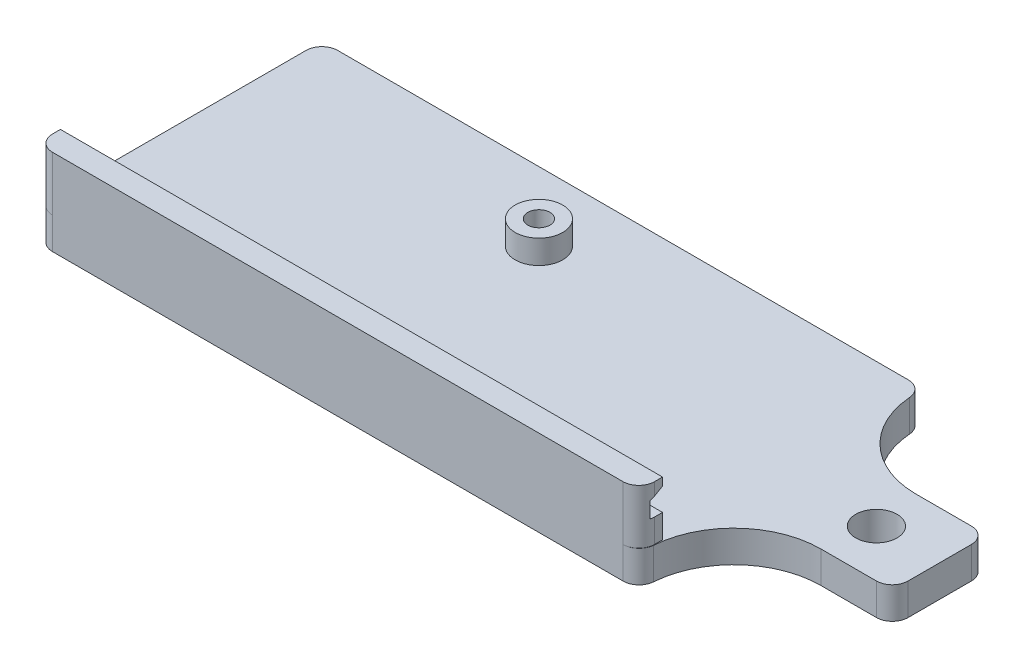
ISO-10303-21;
HEADER;
FILE_DESCRIPTION(('STEP AP214'),'2;1');
FILE_NAME('part.step','',(''),(''),'','','');
FILE_SCHEMA(('AUTOMOTIVE_DESIGN { 1 0 10303 214 1 1 1 1 }'));
ENDSEC;
DATA;
#1=APPLICATION_CONTEXT('core data for automotive mechanical design processes');
#2=APPLICATION_PROTOCOL_DEFINITION('international standard','automotive_design',2000,#1);
#3=PRODUCT_CONTEXT('',#1,'mechanical');
#4=PRODUCT('Part','Part','',(#3));
#5=PRODUCT_RELATED_PRODUCT_CATEGORY('part','',(#4));
#6=PRODUCT_DEFINITION_FORMATION('','',#4);
#7=PRODUCT_DEFINITION_CONTEXT('part definition',#1,'design');
#8=PRODUCT_DEFINITION('design','',#6,#7);
#9=PRODUCT_DEFINITION_SHAPE('','',#8);
#10=(LENGTH_UNIT() NAMED_UNIT(*) SI_UNIT(.MILLI.,.METRE.));
#11=(NAMED_UNIT(*) PLANE_ANGLE_UNIT() SI_UNIT($,.RADIAN.));
#12=(NAMED_UNIT(*) SI_UNIT($,.STERADIAN.) SOLID_ANGLE_UNIT());
#13=UNCERTAINTY_MEASURE_WITH_UNIT(LENGTH_MEASURE(1.E-05),#10,'distance_accuracy_value','');
#14=(GEOMETRIC_REPRESENTATION_CONTEXT(3) GLOBAL_UNCERTAINTY_ASSIGNED_CONTEXT((#13)) GLOBAL_UNIT_ASSIGNED_CONTEXT((#10,
#11,#12)) REPRESENTATION_CONTEXT('',''));
#15=CARTESIAN_POINT('',(0.,0.,0.));
#16=DIRECTION('',(0.,0.,1.));
#17=DIRECTION('',(1.,0.,0.));
#18=AXIS2_PLACEMENT_3D('',#15,#16,#17);
#19=CARTESIAN_POINT('',(76.,0.,0.));
#20=DIRECTION('',(-1.,0.,0.));
#21=DIRECTION('',(0.,0.,1.));
#22=AXIS2_PLACEMENT_3D('',#19,#20,#21);
#23=PLANE('',#22);
#24=DIRECTION('',(0.,0.,-1.));
#25=VECTOR('',#24,1.);
#26=CARTESIAN_POINT('',(76.,10.8660254037844,36.));
#27=LINE('',#26,#25);
#28=CARTESIAN_POINT('',(76.,10.8660254037844,34.));
#29=VERTEX_POINT('',#28);
#30=CARTESIAN_POINT('',(76.,10.8660254037844,33.));
#31=VERTEX_POINT('',#30);
#32=EDGE_CURVE('E204',#29,#31,#27,.T.);
#33=ORIENTED_EDGE('',*,*,#32,.F.);
#34=DIRECTION('',(0.,1.,0.));
#35=VECTOR('',#34,1.);
#36=CARTESIAN_POINT('',(76.,0.,34.));
#37=LINE('',#36,#35);
#38=CARTESIAN_POINT('',(76.,9.28867513459482,34.));
#39=VERTEX_POINT('',#38);
#40=EDGE_CURVE('E387',#29,#39,#37,.F.);
#41=ORIENTED_EDGE('',*,*,#40,.T.);
#42=DIRECTION('',(0.,-0.499999999999997,0.86602540378444));
#43=VECTOR('',#42,1.);
#44=CARTESIAN_POINT('',(76.,9.86602540378444,33.));
#45=LINE('',#44,#43);
#46=CARTESIAN_POINT('',(76.,9.86602540378444,33.));
#47=VERTEX_POINT('',#46);
#48=EDGE_CURVE('E228',#47,#39,#45,.T.);
#49=ORIENTED_EDGE('',*,*,#48,.F.);
#50=DIRECTION('',(0.,-1.,0.));
#51=VECTOR('',#50,1.);
#52=CARTESIAN_POINT('',(76.,10.8660254037844,33.));
#53=LINE('',#52,#51);
#54=EDGE_CURVE('E215',#31,#47,#53,.T.);
#55=ORIENTED_EDGE('',*,*,#54,.F.);
#56=EDGE_LOOP('',(#33,#41,#49,#55));
#57=FACE_BOUND('',#56,.T.);
#58=ADVANCED_FACE('F37',(#57),#23,.F.);
#59=CARTESIAN_POINT('',(0.,4.,2.00000000000001));
#60=DIRECTION('',(1.,0.,0.));
#61=DIRECTION('',(0.,0.,-1.));
#62=AXIS2_PLACEMENT_3D('',#59,#60,#61);
#63=PLANE('',#62);
#64=DIRECTION('',(0.,-1.,0.));
#65=VECTOR('',#64,1.);
#66=CARTESIAN_POINT('',(0.,4.,34.));
#67=LINE('',#66,#65);
#68=CARTESIAN_POINT('',(0.,4.,34.));
#69=VERTEX_POINT('',#68);
#70=CARTESIAN_POINT('',(0.,0.,34.));
#71=VERTEX_POINT('',#70);
#72=EDGE_CURVE('E327',#69,#71,#67,.T.);
#73=ORIENTED_EDGE('',*,*,#72,.F.);
#74=DIRECTION('',(0.,1.,0.));
#75=VECTOR('',#74,1.);
#76=CARTESIAN_POINT('',(0.,4.,34.));
#77=LINE('',#76,#75);
#78=CARTESIAN_POINT('',(0.,7.00000000000001,34.));
#79=VERTEX_POINT('',#78);
#80=EDGE_CURVE('E362',#69,#79,#77,.T.);
#81=ORIENTED_EDGE('',*,*,#80,.T.);
#82=DIRECTION('',(0.,0.,-1.));
#83=VECTOR('',#82,1.);
#84=CARTESIAN_POINT('',(0.,7.00000000000001,34.5));
#85=LINE('',#84,#83);
#86=CARTESIAN_POINT('',(0.,7.00000000000001,33.));
#87=VERTEX_POINT('',#86);
#88=EDGE_CURVE('E245',#79,#87,#85,.T.);
#89=ORIENTED_EDGE('',*,*,#88,.T.);
#90=DIRECTION('',(0.,-1.,0.));
#91=VECTOR('',#90,1.);
#92=CARTESIAN_POINT('',(0.,7.00000000000001,33.));
#93=LINE('',#92,#91);
#94=CARTESIAN_POINT('',(0.,4.,33.));
#95=VERTEX_POINT('',#94);
#96=EDGE_CURVE('E247',#87,#95,#93,.T.);
#97=ORIENTED_EDGE('',*,*,#96,.T.);
#98=DIRECTION('',(0.,0.,1.));
#99=VECTOR('',#98,1.);
#100=CARTESIAN_POINT('',(0.,4.,2.00000000000001));
#101=LINE('',#100,#99);
#102=CARTESIAN_POINT('',(0.,4.,2.00000000000001));
#103=VERTEX_POINT('',#102);
#104=EDGE_CURVE('E286',#103,#95,#101,.T.);
#105=ORIENTED_EDGE('',*,*,#104,.F.);
#106=DIRECTION('',(0.,-1.,0.));
#107=VECTOR('',#106,1.);
#108=CARTESIAN_POINT('',(0.,4.,2.00000000000001));
#109=LINE('',#108,#107);
#110=CARTESIAN_POINT('',(0.,0.,2.00000000000001));
#111=VERTEX_POINT('',#110);
#112=EDGE_CURVE('E330',#103,#111,#109,.T.);
#113=ORIENTED_EDGE('',*,*,#112,.T.);
#114=DIRECTION('',(0.,0.,1.));
#115=VECTOR('',#114,1.);
#116=CARTESIAN_POINT('',(0.,0.,2.00000000000001));
#117=LINE('',#116,#115);
#118=EDGE_CURVE('E314',#111,#71,#117,.T.);
#119=ORIENTED_EDGE('',*,*,#118,.T.);
#120=EDGE_LOOP('',(#73,#81,#89,#97,#105,#113,#119));
#121=FACE_BOUND('',#120,.T.);
#122=ADVANCED_FACE('F454',(#121),#63,.F.);
#123=CARTESIAN_POINT('',(87.,4.,35.));
#124=DIRECTION('',(0.,-1.,0.));
#125=DIRECTION('',(0.,0.,-1.));
#126=AXIS2_PLACEMENT_3D('',#123,#124,#125);
#127=CYLINDRICAL_SURFACE('',#126,11.);
#128=CARTESIAN_POINT('',(87.,0.,35.));
#129=DIRECTION('',(0.,-1.,0.));
#130=DIRECTION('',(0.,0.,1.));
#131=AXIS2_PLACEMENT_3D('',#128,#129,#130);
#132=CIRCLE('',#131,11.);
#133=CARTESIAN_POINT('',(76.0325926642329,0.,34.1538461538462));
#134=VERTEX_POINT('',#133);
#135=CARTESIAN_POINT('',(87.,0.,24.));
#136=VERTEX_POINT('',#135);
#137=EDGE_CURVE('E252',#134,#136,#132,.T.);
#138=ORIENTED_EDGE('',*,*,#137,.T.);
#139=DIRECTION('',(0.,-1.,0.));
#140=VECTOR('',#139,1.);
#141=CARTESIAN_POINT('',(87.,4.,24.));
#142=LINE('',#141,#140);
#143=CARTESIAN_POINT('',(87.,4.,24.));
#144=VERTEX_POINT('',#143);
#145=EDGE_CURVE('E357',#144,#136,#142,.T.);
#146=ORIENTED_EDGE('',*,*,#145,.F.);
#147=CARTESIAN_POINT('',(87.,4.,35.));
#148=DIRECTION('',(0.,-1.,0.));
#149=DIRECTION('',(0.,0.,1.));
#150=AXIS2_PLACEMENT_3D('',#147,#148,#149);
#151=CIRCLE('',#150,11.);
#152=CARTESIAN_POINT('',(76.0325926642329,4.,34.1538461538462));
#153=VERTEX_POINT('',#152);
#154=EDGE_CURVE('E265',#153,#144,#151,.T.);
#155=ORIENTED_EDGE('',*,*,#154,.F.);
#156=DIRECTION('',(0.,-1.,0.));
#157=VECTOR('',#156,1.);
#158=CARTESIAN_POINT('',(76.0325926642329,4.,34.1538461538462));
#159=LINE('',#158,#157);
#160=EDGE_CURVE('E293',#153,#134,#159,.T.);
#161=ORIENTED_EDGE('',*,*,#160,.T.);
#162=EDGE_LOOP('',(#138,#146,#155,#161));
#163=FACE_BOUND('',#162,.T.);
#164=ADVANCED_FACE('F405',(#163),#127,.F.);
#165=CARTESIAN_POINT('',(87.,4.,24.));
#166=DIRECTION('',(0.,0.,-1.));
#167=DIRECTION('',(-1.,0.,0.));
#168=AXIS2_PLACEMENT_3D('',#165,#166,#167);
#169=PLANE('',#168);
#170=DIRECTION('',(1.,0.,0.));
#171=VECTOR('',#170,1.);
#172=CARTESIAN_POINT('',(87.,0.,24.));
#173=LINE('',#172,#171);
#174=CARTESIAN_POINT('',(94.,0.,24.));
#175=VERTEX_POINT('',#174);
#176=EDGE_CURVE('E296',#136,#175,#173,.T.);
#177=ORIENTED_EDGE('',*,*,#176,.T.);
#178=DIRECTION('',(0.,-1.,0.));
#179=VECTOR('',#178,1.);
#180=CARTESIAN_POINT('',(94.,4.,24.));
#181=LINE('',#180,#179);
#182=CARTESIAN_POINT('',(94.,4.,24.));
#183=VERTEX_POINT('',#182);
#184=EDGE_CURVE('E354',#183,#175,#181,.T.);
#185=ORIENTED_EDGE('',*,*,#184,.F.);
#186=DIRECTION('',(1.,0.,0.));
#187=VECTOR('',#186,1.);
#188=CARTESIAN_POINT('',(87.,4.,24.));
#189=LINE('',#188,#187);
#190=EDGE_CURVE('E268',#144,#183,#189,.T.);
#191=ORIENTED_EDGE('',*,*,#190,.F.);
#192=ORIENTED_EDGE('',*,*,#145,.T.);
#193=EDGE_LOOP('',(#177,#185,#191,#192));
#194=FACE_BOUND('',#193,.T.);
#195=ADVANCED_FACE('F412',(#194),#169,.F.);
#196=CARTESIAN_POINT('',(94.,4.,22.));
#197=DIRECTION('',(0.,-1.,0.));
#198=DIRECTION('',(0.,0.,-1.));
#199=AXIS2_PLACEMENT_3D('',#196,#197,#198);
#200=CYLINDRICAL_SURFACE('',#199,2.);
#201=CARTESIAN_POINT('',(94.,0.,22.));
#202=DIRECTION('',(0.,1.,0.));
#203=DIRECTION('',(0.,0.,-1.));
#204=AXIS2_PLACEMENT_3D('',#201,#202,#203);
#205=CIRCLE('',#204,2.);
#206=CARTESIAN_POINT('',(96.,0.,22.));
#207=VERTEX_POINT('',#206);
#208=EDGE_CURVE('E298',#175,#207,#205,.T.);
#209=ORIENTED_EDGE('',*,*,#208,.T.);
#210=DIRECTION('',(0.,-1.,0.));
#211=VECTOR('',#210,1.);
#212=CARTESIAN_POINT('',(96.,4.,22.));
#213=LINE('',#212,#211);
#214=CARTESIAN_POINT('',(96.,4.,22.));
#215=VERTEX_POINT('',#214);
#216=EDGE_CURVE('E351',#215,#207,#213,.T.);
#217=ORIENTED_EDGE('',*,*,#216,.F.);
#218=CARTESIAN_POINT('',(94.,4.,22.));
#219=DIRECTION('',(0.,1.,0.));
#220=DIRECTION('',(0.,0.,-1.));
#221=AXIS2_PLACEMENT_3D('',#218,#219,#220);
#222=CIRCLE('',#221,2.);
#223=EDGE_CURVE('E270',#183,#215,#222,.T.);
#224=ORIENTED_EDGE('',*,*,#223,.F.);
#225=ORIENTED_EDGE('',*,*,#184,.T.);
#226=EDGE_LOOP('',(#209,#217,#224,#225));
#227=FACE_BOUND('',#226,.T.);
#228=ADVANCED_FACE('F418',(#227),#200,.T.);
#229=CARTESIAN_POINT('',(96.,4.,14.));
#230=DIRECTION('',(-1.,0.,0.));
#231=DIRECTION('',(0.,0.,1.));
#232=AXIS2_PLACEMENT_3D('',#229,#230,#231);
#233=PLANE('',#232);
#234=DIRECTION('',(0.,0.,-1.));
#235=VECTOR('',#234,1.);
#236=CARTESIAN_POINT('',(96.,0.,14.));
#237=LINE('',#236,#235);
#238=CARTESIAN_POINT('',(96.,0.,14.));
#239=VERTEX_POINT('',#238);
#240=EDGE_CURVE('E300',#207,#239,#237,.T.);
#241=ORIENTED_EDGE('',*,*,#240,.T.);
#242=DIRECTION('',(0.,-1.,0.));
#243=VECTOR('',#242,1.);
#244=CARTESIAN_POINT('',(96.,4.,14.));
#245=LINE('',#244,#243);
#246=CARTESIAN_POINT('',(96.,4.,14.));
#247=VERTEX_POINT('',#246);
#248=EDGE_CURVE('E348',#247,#239,#245,.T.);
#249=ORIENTED_EDGE('',*,*,#248,.F.);
#250=DIRECTION('',(0.,0.,-1.));
#251=VECTOR('',#250,1.);
#252=CARTESIAN_POINT('',(96.,4.,14.));
#253=LINE('',#252,#251);
#254=EDGE_CURVE('E272',#215,#247,#253,.T.);
#255=ORIENTED_EDGE('',*,*,#254,.F.);
#256=ORIENTED_EDGE('',*,*,#216,.T.);
#257=EDGE_LOOP('',(#241,#249,#255,#256));
#258=FACE_BOUND('',#257,.T.);
#259=ADVANCED_FACE('F420',(#258),#233,.F.);
#260=CARTESIAN_POINT('',(94.,4.,14.));
#261=DIRECTION('',(0.,-1.,0.));
#262=DIRECTION('',(0.,0.,-1.));
#263=AXIS2_PLACEMENT_3D('',#260,#261,#262);
#264=CYLINDRICAL_SURFACE('',#263,2.);
#265=CARTESIAN_POINT('',(94.,0.,14.));
#266=DIRECTION('',(0.,1.,0.));
#267=DIRECTION('',(0.,0.,1.));
#268=AXIS2_PLACEMENT_3D('',#265,#266,#267);
#269=CIRCLE('',#268,2.);
#270=CARTESIAN_POINT('',(94.,0.,12.));
#271=VERTEX_POINT('',#270);
#272=EDGE_CURVE('E302',#239,#271,#269,.T.);
#273=ORIENTED_EDGE('',*,*,#272,.T.);
#274=DIRECTION('',(0.,-1.,0.));
#275=VECTOR('',#274,1.);
#276=CARTESIAN_POINT('',(94.,4.,12.));
#277=LINE('',#276,#275);
#278=CARTESIAN_POINT('',(94.,4.,12.));
#279=VERTEX_POINT('',#278);
#280=EDGE_CURVE('E345',#279,#271,#277,.T.);
#281=ORIENTED_EDGE('',*,*,#280,.F.);
#282=CARTESIAN_POINT('',(94.,4.,14.));
#283=DIRECTION('',(0.,1.,0.));
#284=DIRECTION('',(0.,0.,1.));
#285=AXIS2_PLACEMENT_3D('',#282,#283,#284);
#286=CIRCLE('',#285,2.);
#287=EDGE_CURVE('E274',#247,#279,#286,.T.);
#288=ORIENTED_EDGE('',*,*,#287,.F.);
#289=ORIENTED_EDGE('',*,*,#248,.T.);
#290=EDGE_LOOP('',(#273,#281,#288,#289));
#291=FACE_BOUND('',#290,.T.);
#292=ADVANCED_FACE('F425',(#291),#264,.T.);
#293=CARTESIAN_POINT('',(87.,4.,12.));
#294=DIRECTION('',(0.,0.,1.));
#295=DIRECTION('',(1.,0.,0.));
#296=AXIS2_PLACEMENT_3D('',#293,#294,#295);
#297=PLANE('',#296);
#298=DIRECTION('',(-1.,0.,0.));
#299=VECTOR('',#298,1.);
#300=CARTESIAN_POINT('',(87.,0.,12.));
#301=LINE('',#300,#299);
#302=CARTESIAN_POINT('',(87.,0.,12.));
#303=VERTEX_POINT('',#302);
#304=EDGE_CURVE('E304',#271,#303,#301,.T.);
#305=ORIENTED_EDGE('',*,*,#304,.T.);
#306=DIRECTION('',(0.,-1.,0.));
#307=VECTOR('',#306,1.);
#308=CARTESIAN_POINT('',(87.,4.,12.));
#309=LINE('',#308,#307);
#310=CARTESIAN_POINT('',(87.,4.,12.));
#311=VERTEX_POINT('',#310);
#312=EDGE_CURVE('E342',#311,#303,#309,.T.);
#313=ORIENTED_EDGE('',*,*,#312,.F.);
#314=DIRECTION('',(-1.,0.,0.));
#315=VECTOR('',#314,1.);
#316=CARTESIAN_POINT('',(87.,4.,12.));
#317=LINE('',#316,#315);
#318=EDGE_CURVE('E276',#279,#311,#317,.T.);
#319=ORIENTED_EDGE('',*,*,#318,.F.);
#320=ORIENTED_EDGE('',*,*,#280,.T.);
#321=EDGE_LOOP('',(#305,#313,#319,#320));
#322=FACE_BOUND('',#321,.T.);
#323=ADVANCED_FACE('F431',(#322),#297,.F.);
#324=CARTESIAN_POINT('',(87.,4.,0.999999999999999));
#325=DIRECTION('',(0.,-1.,0.));
#326=DIRECTION('',(0.,0.,-1.));
#327=AXIS2_PLACEMENT_3D('',#324,#325,#326);
#328=CYLINDRICAL_SURFACE('',#327,11.);
#329=CARTESIAN_POINT('',(87.,0.,0.999999999999999));
#330=DIRECTION('',(0.,-1.,0.));
#331=DIRECTION('',(0.,0.,1.));
#332=AXIS2_PLACEMENT_3D('',#329,#330,#331);
#333=CIRCLE('',#332,11.);
#334=CARTESIAN_POINT('',(76.0325926642329,0.,1.84615384615385));
#335=VERTEX_POINT('',#334);
#336=EDGE_CURVE('E306',#303,#335,#333,.T.);
#337=ORIENTED_EDGE('',*,*,#336,.T.);
#338=DIRECTION('',(0.,-1.,0.));
#339=VECTOR('',#338,1.);
#340=CARTESIAN_POINT('',(76.0325926642329,4.,1.84615384615385));
#341=LINE('',#340,#339);
#342=CARTESIAN_POINT('',(76.0325926642329,4.,1.84615384615385));
#343=VERTEX_POINT('',#342);
#344=EDGE_CURVE('E339',#343,#335,#341,.T.);
#345=ORIENTED_EDGE('',*,*,#344,.F.);
#346=CARTESIAN_POINT('',(87.,4.,0.999999999999999));
#347=DIRECTION('',(0.,-1.,0.));
#348=DIRECTION('',(0.,0.,1.));
#349=AXIS2_PLACEMENT_3D('',#346,#347,#348);
#350=CIRCLE('',#349,11.);
#351=EDGE_CURVE('E278',#311,#343,#350,.T.);
#352=ORIENTED_EDGE('',*,*,#351,.F.);
#353=ORIENTED_EDGE('',*,*,#312,.T.);
#354=EDGE_LOOP('',(#337,#345,#352,#353));
#355=FACE_BOUND('',#354,.T.);
#356=ADVANCED_FACE('F435',(#355),#328,.F.);
#357=CARTESIAN_POINT('',(74.0385186031843,4.,2.));
#358=DIRECTION('',(0.,-1.,0.));
#359=DIRECTION('',(0.,0.,-1.));
#360=AXIS2_PLACEMENT_3D('',#357,#358,#359);
#361=CYLINDRICAL_SURFACE('',#360,2.);
#362=CARTESIAN_POINT('',(74.0385186031843,0.,2.));
#363=DIRECTION('',(0.,1.,0.));
#364=DIRECTION('',(0.,0.,1.));
#365=AXIS2_PLACEMENT_3D('',#362,#363,#364);
#366=CIRCLE('',#365,2.);
#367=CARTESIAN_POINT('',(74.0385186031843,0.,0.));
#368=VERTEX_POINT('',#367);
#369=EDGE_CURVE('E308',#335,#368,#366,.T.);
#370=ORIENTED_EDGE('',*,*,#369,.T.);
#371=DIRECTION('',(0.,-1.,0.));
#372=VECTOR('',#371,1.);
#373=CARTESIAN_POINT('',(74.0385186031843,4.,0.));
#374=LINE('',#373,#372);
#375=CARTESIAN_POINT('',(74.0385186031843,4.,0.));
#376=VERTEX_POINT('',#375);
#377=EDGE_CURVE('E336',#376,#368,#374,.T.);
#378=ORIENTED_EDGE('',*,*,#377,.F.);
#379=CARTESIAN_POINT('',(74.0385186031843,4.,2.));
#380=DIRECTION('',(0.,1.,0.));
#381=DIRECTION('',(0.,0.,1.));
#382=AXIS2_PLACEMENT_3D('',#379,#380,#381);
#383=CIRCLE('',#382,2.);
#384=EDGE_CURVE('E280',#343,#376,#383,.T.);
#385=ORIENTED_EDGE('',*,*,#384,.F.);
#386=ORIENTED_EDGE('',*,*,#344,.T.);
#387=EDGE_LOOP('',(#370,#378,#385,#386));
#388=FACE_BOUND('',#387,.T.);
#389=ADVANCED_FACE('F440',(#388),#361,.T.);
#390=CARTESIAN_POINT('',(2.00000000000001,4.,0.));
#391=DIRECTION('',(0.,0.,1.));
#392=DIRECTION('',(1.,0.,0.));
#393=AXIS2_PLACEMENT_3D('',#390,#391,#392);
#394=PLANE('',#393);
#395=DIRECTION('',(-1.,0.,0.));
#396=VECTOR('',#395,1.);
#397=CARTESIAN_POINT('',(2.00000000000001,0.,0.));
#398=LINE('',#397,#396);
#399=CARTESIAN_POINT('',(2.00000000000001,0.,0.));
#400=VERTEX_POINT('',#399);
#401=EDGE_CURVE('E310',#368,#400,#398,.T.);
#402=ORIENTED_EDGE('',*,*,#401,.T.);
#403=DIRECTION('',(0.,-1.,0.));
#404=VECTOR('',#403,1.);
#405=CARTESIAN_POINT('',(2.00000000000001,4.,0.));
#406=LINE('',#405,#404);
#407=CARTESIAN_POINT('',(2.00000000000001,4.,0.));
#408=VERTEX_POINT('',#407);
#409=EDGE_CURVE('E333',#408,#400,#406,.T.);
#410=ORIENTED_EDGE('',*,*,#409,.F.);
#411=DIRECTION('',(-1.,0.,0.));
#412=VECTOR('',#411,1.);
#413=CARTESIAN_POINT('',(2.00000000000001,4.,0.));
#414=LINE('',#413,#412);
#415=EDGE_CURVE('E282',#376,#408,#414,.T.);
#416=ORIENTED_EDGE('',*,*,#415,.F.);
#417=ORIENTED_EDGE('',*,*,#377,.T.);
#418=EDGE_LOOP('',(#402,#410,#416,#417));
#419=FACE_BOUND('',#418,.T.);
#420=ADVANCED_FACE('F446',(#419),#394,.F.);
#421=CARTESIAN_POINT('',(2.,4.,2.));
#422=DIRECTION('',(0.,-1.,0.));
#423=DIRECTION('',(0.,0.,-1.));
#424=AXIS2_PLACEMENT_3D('',#421,#422,#423);
#425=CYLINDRICAL_SURFACE('',#424,2.);
#426=CARTESIAN_POINT('',(2.,0.,2.));
#427=DIRECTION('',(0.,1.,0.));
#428=DIRECTION('',(0.,0.,-1.));
#429=AXIS2_PLACEMENT_3D('',#426,#427,#428);
#430=CIRCLE('',#429,2.);
#431=EDGE_CURVE('E312',#400,#111,#430,.T.);
#432=ORIENTED_EDGE('',*,*,#431,.T.);
#433=ORIENTED_EDGE('',*,*,#112,.F.);
#434=CARTESIAN_POINT('',(2.,4.,2.));
#435=DIRECTION('',(0.,1.,0.));
#436=DIRECTION('',(0.,0.,-1.));
#437=AXIS2_PLACEMENT_3D('',#434,#435,#436);
#438=CIRCLE('',#437,2.);
#439=EDGE_CURVE('E284',#408,#103,#438,.T.);
#440=ORIENTED_EDGE('',*,*,#439,.F.);
#441=ORIENTED_EDGE('',*,*,#409,.T.);
#442=EDGE_LOOP('',(#432,#433,#440,#441));
#443=FACE_BOUND('',#442,.T.);
#444=ADVANCED_FACE('F450',(#443),#425,.T.);
#445=DIRECTION('',(0.,-0.499999999999997,0.86602540378444));
#446=VECTOR('',#445,1.);
#447=CARTESIAN_POINT('',(0.,9.86602540378444,33.));
#448=LINE('',#447,#446);
#449=CARTESIAN_POINT('',(0.,9.86602540378444,33.));
#450=VERTEX_POINT('',#449);
#451=CARTESIAN_POINT('',(0.,9.28867513459482,34.));
#452=VERTEX_POINT('',#451);
#453=EDGE_CURVE('E242',#450,#452,#448,.T.);
#454=ORIENTED_EDGE('',*,*,#453,.T.);
#455=DIRECTION('',(0.,1.,0.));
#456=VECTOR('',#455,1.);
#457=CARTESIAN_POINT('',(0.,4.,34.));
#458=LINE('',#457,#456);
#459=CARTESIAN_POINT('',(0.,10.8660254037844,34.));
#460=VERTEX_POINT('',#459);
#461=EDGE_CURVE('E360',#452,#460,#458,.T.);
#462=ORIENTED_EDGE('',*,*,#461,.T.);
#463=DIRECTION('',(0.,0.,-1.));
#464=VECTOR('',#463,1.);
#465=CARTESIAN_POINT('',(0.,10.8660254037844,36.));
#466=LINE('',#465,#464);
#467=CARTESIAN_POINT('',(0.,10.8660254037844,33.));
#468=VERTEX_POINT('',#467);
#469=EDGE_CURVE('E238',#460,#468,#466,.T.);
#470=ORIENTED_EDGE('',*,*,#469,.T.);
#471=DIRECTION('',(0.,-1.,0.));
#472=VECTOR('',#471,1.);
#473=CARTESIAN_POINT('',(0.,10.8660254037844,33.));
#474=LINE('',#473,#472);
#475=EDGE_CURVE('E222',#468,#450,#474,.T.);
#476=ORIENTED_EDGE('',*,*,#475,.T.);
#477=EDGE_LOOP('',(#454,#462,#470,#476));
#478=FACE_BOUND('',#477,.T.);
#479=ADVANCED_FACE('F506',(#478),#63,.F.);
#480=CARTESIAN_POINT('',(2.,4.,34.));
#481=DIRECTION('',(0.,-1.,0.));
#482=DIRECTION('',(0.,0.,-1.));
#483=AXIS2_PLACEMENT_3D('',#480,#481,#482);
#484=CYLINDRICAL_SURFACE('',#483,2.);
#485=CARTESIAN_POINT('',(2.,0.,34.));
#486=DIRECTION('',(0.,1.,0.));
#487=DIRECTION('',(0.,0.,1.));
#488=AXIS2_PLACEMENT_3D('',#485,#486,#487);
#489=CIRCLE('',#488,2.);
#490=CARTESIAN_POINT('',(2.,0.,36.));
#491=VERTEX_POINT('',#490);
#492=EDGE_CURVE('E316',#71,#491,#489,.T.);
#493=ORIENTED_EDGE('',*,*,#492,.T.);
#494=DIRECTION('',(0.,-1.,0.));
#495=VECTOR('',#494,1.);
#496=CARTESIAN_POINT('',(2.,4.,36.));
#497=LINE('',#496,#495);
#498=CARTESIAN_POINT('',(2.,4.,36.));
#499=VERTEX_POINT('',#498);
#500=EDGE_CURVE('E324',#499,#491,#497,.T.);
#501=ORIENTED_EDGE('',*,*,#500,.F.);
#502=CARTESIAN_POINT('',(2.,4.,34.));
#503=DIRECTION('',(0.,1.,0.));
#504=DIRECTION('',(0.,0.,1.));
#505=AXIS2_PLACEMENT_3D('',#502,#503,#504);
#506=CIRCLE('',#505,2.);
#507=EDGE_CURVE('E289',#69,#499,#506,.T.);
#508=ORIENTED_EDGE('',*,*,#507,.F.);
#509=ORIENTED_EDGE('',*,*,#72,.T.);
#510=EDGE_LOOP('',(#493,#501,#508,#509));
#511=FACE_BOUND('',#510,.T.);
#512=ADVANCED_FACE('F532',(#511),#484,.T.);
#513=CARTESIAN_POINT('',(2.00000000000002,4.,36.));
#514=DIRECTION('',(0.,0.,-1.));
#515=DIRECTION('',(-1.,0.,0.));
#516=AXIS2_PLACEMENT_3D('',#513,#514,#515);
#517=PLANE('',#516);
#518=DIRECTION('',(-1.,0.,0.));
#519=VECTOR('',#518,1.);
#520=CARTESIAN_POINT('',(76.,10.8660254037844,36.));
#521=LINE('',#520,#519);
#522=CARTESIAN_POINT('',(74.,10.8660254037844,36.));
#523=VERTEX_POINT('',#522);
#524=CARTESIAN_POINT('',(2.,10.8660254037844,36.));
#525=VERTEX_POINT('',#524);
#526=EDGE_CURVE('E224',#523,#525,#521,.T.);
#527=ORIENTED_EDGE('',*,*,#526,.T.);
#528=DIRECTION('',(0.,1.,0.));
#529=VECTOR('',#528,1.);
#530=CARTESIAN_POINT('',(2.00000000000002,4.,36.));
#531=LINE('',#530,#529);
#532=EDGE_CURVE('E383',#525,#499,#531,.F.);
#533=ORIENTED_EDGE('',*,*,#532,.T.);
#534=ORIENTED_EDGE('',*,*,#500,.T.);
#535=DIRECTION('',(1.,0.,0.));
#536=VECTOR('',#535,1.);
#537=CARTESIAN_POINT('',(2.00000000000002,0.,36.));
#538=LINE('',#537,#536);
#539=CARTESIAN_POINT('',(74.,0.,36.));
#540=VERTEX_POINT('',#539);
#541=EDGE_CURVE('E318',#491,#540,#538,.T.);
#542=ORIENTED_EDGE('',*,*,#541,.T.);
#543=DIRECTION('',(0.,1.,0.));
#544=VECTOR('',#543,1.);
#545=CARTESIAN_POINT('',(74.,4.,36.));
#546=LINE('',#545,#544);
#547=EDGE_CURVE('E380',#540,#523,#546,.T.);
#548=ORIENTED_EDGE('',*,*,#547,.T.);
#549=EDGE_LOOP('',(#527,#533,#534,#542,#548));
#550=FACE_BOUND('',#549,.T.);
#551=ADVANCED_FACE('F529',(#550),#517,.F.);
#552=CARTESIAN_POINT('',(74.0385186031843,4.,34.));
#553=DIRECTION('',(0.,-1.,0.));
#554=DIRECTION('',(0.,0.,-1.));
#555=AXIS2_PLACEMENT_3D('',#552,#553,#554);
#556=CYLINDRICAL_SURFACE('',#555,2.);
#557=CARTESIAN_POINT('',(74.0385186031843,0.,34.));
#558=DIRECTION('',(0.,1.,0.));
#559=DIRECTION('',(0.,0.,-1.));
#560=AXIS2_PLACEMENT_3D('',#557,#558,#559);
#561=CIRCLE('',#560,2.);
#562=CARTESIAN_POINT('',(74.0192593015922,0.,35.9999072676757));
#563=VERTEX_POINT('',#562);
#564=EDGE_CURVE('E60',#563,#134,#561,.T.);
#565=ORIENTED_EDGE('',*,*,#564,.T.);
#566=ORIENTED_EDGE('',*,*,#160,.F.);
#567=CARTESIAN_POINT('',(74.0385186031843,4.,34.));
#568=DIRECTION('',(0.,1.,0.));
#569=DIRECTION('',(0.,0.,-1.));
#570=AXIS2_PLACEMENT_3D('',#567,#568,#569);
#571=CIRCLE('',#570,2.);
#572=CARTESIAN_POINT('',(74.0192593015922,4.,35.9999072676757));
#573=VERTEX_POINT('',#572);
#574=EDGE_CURVE('E52',#573,#153,#571,.T.);
#575=ORIENTED_EDGE('',*,*,#574,.F.);
#576=DIRECTION('',(0.,1.,0.));
#577=VECTOR('',#576,1.);
#578=CARTESIAN_POINT('',(74.0192593015922,4.,35.9999072676757));
#579=LINE('',#578,#577);
#580=EDGE_CURVE('E11',#573,#563,#579,.F.);
#581=ORIENTED_EDGE('',*,*,#580,.T.);
#582=EDGE_LOOP('',(#565,#566,#575,#581));
#583=FACE_BOUND('',#582,.T.);
#584=ADVANCED_FACE('F402',(#583),#556,.T.);
#585=CARTESIAN_POINT('',(87.,4.,35.));
#586=DIRECTION('',(0.,1.,0.));
#587=DIRECTION('',(0.,0.,1.));
#588=AXIS2_PLACEMENT_3D('',#585,#586,#587);
#589=PLANE('',#588);
#590=CARTESIAN_POINT('',(88.,4.,18.));
#591=DIRECTION('',(0.,1.,0.));
#592=DIRECTION('',(0.,0.,1.));
#593=AXIS2_PLACEMENT_3D('',#590,#591,#592);
#594=CIRCLE('',#593,2.6);
#595=CARTESIAN_POINT('',(88.,4.,20.6));
#596=VERTEX_POINT('',#595);
#597=EDGE_CURVE('E469',#596,#596,#594,.T.);
#598=ORIENTED_EDGE('',*,*,#597,.F.);
#599=EDGE_LOOP('',(#598));
#600=FACE_BOUND('',#599,.T.);
#601=CARTESIAN_POINT('',(36.1,4.,8.7));
#602=DIRECTION('',(0.,1.,0.));
#603=DIRECTION('',(0.,0.,1.));
#604=AXIS2_PLACEMENT_3D('',#601,#602,#603);
#605=CIRCLE('',#604,3.);
#606=CARTESIAN_POINT('',(36.1,4.,11.7));
#607=VERTEX_POINT('',#606);
#608=EDGE_CURVE('E466',#607,#607,#605,.T.);
#609=ORIENTED_EDGE('',*,*,#608,.F.);
#610=EDGE_LOOP('',(#609));
#611=FACE_BOUND('',#610,.T.);
#612=DIRECTION('',(-1.,0.,0.));
#613=VECTOR('',#612,1.);
#614=CARTESIAN_POINT('',(76.,4.,33.));
#615=LINE('',#614,#613);
#616=CARTESIAN_POINT('',(76.,4.,33.));
#617=VERTEX_POINT('',#616);
#618=EDGE_CURVE('E250',#617,#95,#615,.T.);
#619=ORIENTED_EDGE('',*,*,#618,.F.);
#620=DIRECTION('',(0.,0.,1.));
#621=VECTOR('',#620,1.);
#622=CARTESIAN_POINT('',(76.,4.,33.));
#623=LINE('',#622,#621);
#624=CARTESIAN_POINT('',(76.,4.,34.));
#625=VERTEX_POINT('',#624);
#626=EDGE_CURVE('E216',#617,#625,#623,.T.);
#627=ORIENTED_EDGE('',*,*,#626,.T.);
#628=CARTESIAN_POINT('',(74.,4.,34.));
#629=DIRECTION('',(0.,1.,0.));
#630=DIRECTION('',(0.,0.,1.));
#631=AXIS2_PLACEMENT_3D('',#628,#629,#630);
#632=CIRCLE('',#631,2.);
#633=EDGE_CURVE('E46',#625,#573,#632,.F.);
#634=ORIENTED_EDGE('',*,*,#633,.T.);
#635=ORIENTED_EDGE('',*,*,#574,.T.);
#636=ORIENTED_EDGE('',*,*,#154,.T.);
#637=ORIENTED_EDGE('',*,*,#190,.T.);
#638=ORIENTED_EDGE('',*,*,#223,.T.);
#639=ORIENTED_EDGE('',*,*,#254,.T.);
#640=ORIENTED_EDGE('',*,*,#287,.T.);
#641=ORIENTED_EDGE('',*,*,#318,.T.);
#642=ORIENTED_EDGE('',*,*,#351,.T.);
#643=ORIENTED_EDGE('',*,*,#384,.T.);
#644=ORIENTED_EDGE('',*,*,#415,.T.);
#645=ORIENTED_EDGE('',*,*,#439,.T.);
#646=ORIENTED_EDGE('',*,*,#104,.T.);
#647=EDGE_LOOP('',(#619,#627,#634,#635,#636,#637,#638,#639,#640,#641,#642,#643,#644,#645,#646));
#648=FACE_BOUND('',#647,.T.);
#649=ADVANCED_FACE('F396',(#600,#611,#648),#589,.T.);
#650=CARTESIAN_POINT('',(87.,0.,35.));
#651=DIRECTION('',(0.,1.,0.));
#652=DIRECTION('',(0.,0.,1.));
#653=AXIS2_PLACEMENT_3D('',#650,#651,#652);
#654=PLANE('',#653);
#655=CARTESIAN_POINT('',(88.,0.,18.));
#656=DIRECTION('',(0.,1.,0.));
#657=DIRECTION('',(0.,0.,1.));
#658=AXIS2_PLACEMENT_3D('',#655,#656,#657);
#659=CIRCLE('',#658,2.6);
#660=CARTESIAN_POINT('',(88.,0.,20.6));
#661=VERTEX_POINT('',#660);
#662=EDGE_CURVE('E475',#661,#661,#659,.T.);
#663=ORIENTED_EDGE('',*,*,#662,.T.);
#664=EDGE_LOOP('',(#663));
#665=FACE_BOUND('',#664,.T.);
#666=CARTESIAN_POINT('',(36.1,0.,8.7));
#667=DIRECTION('',(0.,1.,0.));
#668=DIRECTION('',(0.,0.,1.));
#669=AXIS2_PLACEMENT_3D('',#666,#667,#668);
#670=CIRCLE('',#669,1.4);
#671=CARTESIAN_POINT('',(36.1,0.,10.1));
#672=VERTEX_POINT('',#671);
#673=EDGE_CURVE('E472',#672,#672,#670,.T.);
#674=ORIENTED_EDGE('',*,*,#673,.T.);
#675=EDGE_LOOP('',(#674));
#676=FACE_BOUND('',#675,.T.);
#677=ORIENTED_EDGE('',*,*,#564,.F.);
#678=CARTESIAN_POINT('',(74.,0.,34.));
#679=DIRECTION('',(0.,1.,0.));
#680=DIRECTION('',(0.,0.,1.));
#681=AXIS2_PLACEMENT_3D('',#678,#679,#680);
#682=CIRCLE('',#681,2.);
#683=EDGE_CURVE('E389',#563,#540,#682,.F.);
#684=ORIENTED_EDGE('',*,*,#683,.T.);
#685=ORIENTED_EDGE('',*,*,#541,.F.);
#686=ORIENTED_EDGE('',*,*,#492,.F.);
#687=ORIENTED_EDGE('',*,*,#118,.F.);
#688=ORIENTED_EDGE('',*,*,#431,.F.);
#689=ORIENTED_EDGE('',*,*,#401,.F.);
#690=ORIENTED_EDGE('',*,*,#369,.F.);
#691=ORIENTED_EDGE('',*,*,#336,.F.);
#692=ORIENTED_EDGE('',*,*,#304,.F.);
#693=ORIENTED_EDGE('',*,*,#272,.F.);
#694=ORIENTED_EDGE('',*,*,#240,.F.);
#695=ORIENTED_EDGE('',*,*,#208,.F.);
#696=ORIENTED_EDGE('',*,*,#176,.F.);
#697=ORIENTED_EDGE('',*,*,#137,.F.);
#698=EDGE_LOOP('',(#677,#684,#685,#686,#687,#688,#689,#690,#691,#692,#693,#694,#695,#696,#697));
#699=FACE_BOUND('',#698,.T.);
#700=ADVANCED_FACE('F407',(#665,#676,#699),#654,.F.);
#701=CARTESIAN_POINT('',(76.,7.00000000000001,33.));
#702=DIRECTION('',(0.,0.,-1.));
#703=DIRECTION('',(0.,1.,0.));
#704=AXIS2_PLACEMENT_3D('',#701,#702,#703);
#705=PLANE('',#704);
#706=ORIENTED_EDGE('',*,*,#96,.F.);
#707=DIRECTION('',(-1.,0.,0.));
#708=VECTOR('',#707,1.);
#709=CARTESIAN_POINT('',(76.,7.00000000000001,33.));
#710=LINE('',#709,#708);
#711=CARTESIAN_POINT('',(76.,7.00000000000001,33.));
#712=VERTEX_POINT('',#711);
#713=EDGE_CURVE('E253',#712,#87,#710,.T.);
#714=ORIENTED_EDGE('',*,*,#713,.F.);
#715=DIRECTION('',(0.,-1.,0.));
#716=VECTOR('',#715,1.);
#717=CARTESIAN_POINT('',(76.,7.00000000000001,33.));
#718=LINE('',#717,#716);
#719=EDGE_CURVE('E235',#712,#617,#718,.T.);
#720=ORIENTED_EDGE('',*,*,#719,.T.);
#721=ORIENTED_EDGE('',*,*,#618,.T.);
#722=EDGE_LOOP('',(#706,#714,#720,#721));
#723=FACE_BOUND('',#722,.T.);
#724=ADVANCED_FACE('F457',(#723),#705,.T.);
#725=CARTESIAN_POINT('',(76.,7.00000000000001,34.5));
#726=DIRECTION('',(0.,1.,0.));
#727=DIRECTION('',(0.,0.,1.));
#728=AXIS2_PLACEMENT_3D('',#725,#726,#727);
#729=PLANE('',#728);
#730=ORIENTED_EDGE('',*,*,#88,.F.);
#731=CARTESIAN_POINT('',(2.,7.00000000000001,34.));
#732=DIRECTION('',(0.,1.,0.));
#733=DIRECTION('',(0.,0.,1.));
#734=AXIS2_PLACEMENT_3D('',#731,#732,#733);
#735=CIRCLE('',#734,2.);
#736=CARTESIAN_POINT('',(0.0635083268962916,7.00000000000001,34.5));
#737=VERTEX_POINT('',#736);
#738=EDGE_CURVE('E367',#79,#737,#735,.T.);
#739=ORIENTED_EDGE('',*,*,#738,.T.);
#740=DIRECTION('',(-1.,0.,0.));
#741=VECTOR('',#740,1.);
#742=CARTESIAN_POINT('',(76.,7.00000000000001,34.5));
#743=LINE('',#742,#741);
#744=CARTESIAN_POINT('',(75.9364916731037,7.00000000000001,34.5));
#745=VERTEX_POINT('',#744);
#746=EDGE_CURVE('E256',#745,#737,#743,.T.);
#747=ORIENTED_EDGE('',*,*,#746,.F.);
#748=CARTESIAN_POINT('',(74.,7.00000000000001,34.));
#749=DIRECTION('',(0.,1.,0.));
#750=DIRECTION('',(0.,0.,1.));
#751=AXIS2_PLACEMENT_3D('',#748,#749,#750);
#752=CIRCLE('',#751,2.);
#753=CARTESIAN_POINT('',(76.,7.00000000000001,34.));
#754=VERTEX_POINT('',#753);
#755=EDGE_CURVE('E365',#745,#754,#752,.T.);
#756=ORIENTED_EDGE('',*,*,#755,.T.);
#757=DIRECTION('',(0.,0.,-1.));
#758=VECTOR('',#757,1.);
#759=CARTESIAN_POINT('',(76.,7.00000000000001,34.5));
#760=LINE('',#759,#758);
#761=EDGE_CURVE('E230',#754,#712,#760,.T.);
#762=ORIENTED_EDGE('',*,*,#761,.T.);
#763=ORIENTED_EDGE('',*,*,#713,.T.);
#764=EDGE_LOOP('',(#730,#739,#747,#756,#762,#763));
#765=FACE_BOUND('',#764,.T.);
#766=ADVANCED_FACE('F630',(#765),#729,.T.);
#767=CARTESIAN_POINT('',(76.,9.00000000000001,34.5));
#768=DIRECTION('',(0.,0.,-1.));
#769=DIRECTION('',(-1.,0.,0.));
#770=AXIS2_PLACEMENT_3D('',#767,#768,#769);
#771=PLANE('',#770);
#772=ORIENTED_EDGE('',*,*,#746,.T.);
#773=DIRECTION('',(0.,1.,0.));
#774=VECTOR('',#773,1.);
#775=CARTESIAN_POINT('',(0.0635083268962972,7.00000000000001,34.5));
#776=LINE('',#775,#774);
#777=CARTESIAN_POINT('',(0.0635083268963055,9.00000000000001,34.5));
#778=VERTEX_POINT('',#777);
#779=EDGE_CURVE('E371',#737,#778,#776,.T.);
#780=ORIENTED_EDGE('',*,*,#779,.T.);
#781=DIRECTION('',(-1.,0.,0.));
#782=VECTOR('',#781,1.);
#783=CARTESIAN_POINT('',(76.,9.00000000000001,34.5));
#784=LINE('',#783,#782);
#785=CARTESIAN_POINT('',(75.9364916731037,9.00000000000001,34.5));
#786=VERTEX_POINT('',#785);
#787=EDGE_CURVE('E259',#786,#778,#784,.T.);
#788=ORIENTED_EDGE('',*,*,#787,.F.);
#789=DIRECTION('',(0.,1.,0.));
#790=VECTOR('',#789,1.);
#791=CARTESIAN_POINT('',(75.9364916731037,9.00000000000001,34.5));
#792=LINE('',#791,#790);
#793=EDGE_CURVE('E369',#786,#745,#792,.F.);
#794=ORIENTED_EDGE('',*,*,#793,.T.);
#795=EDGE_LOOP('',(#772,#780,#788,#794));
#796=FACE_BOUND('',#795,.T.);
#797=ADVANCED_FACE('F636',(#796),#771,.T.);
#798=CARTESIAN_POINT('',(76.,9.86602540378444,33.));
#799=DIRECTION('',(0.,-0.86602540378444,-0.499999999999997));
#800=DIRECTION('',(0.,0.499999999999997,-0.86602540378444));
#801=AXIS2_PLACEMENT_3D('',#798,#799,#800);
#802=PLANE('',#801);
#803=ORIENTED_EDGE('',*,*,#787,.T.);
#804=CARTESIAN_POINT('',(2.,9.28867513459483,34.));
#805=DIRECTION('',(0.,-0.86602540378444,-0.499999999999997));
#806=DIRECTION('',(0.,0.499999999999997,-0.86602540378444));
#807=AXIS2_PLACEMENT_3D('',#804,#805,#806);
#808=ELLIPSE('',#807,2.3094010767585,2.);
#809=EDGE_CURVE('E375',#778,#452,#808,.T.);
#810=ORIENTED_EDGE('',*,*,#809,.T.);
#811=ORIENTED_EDGE('',*,*,#453,.F.);
#812=DIRECTION('',(-1.,0.,0.));
#813=VECTOR('',#812,1.);
#814=CARTESIAN_POINT('',(76.,9.86602540378444,33.));
#815=LINE('',#814,#813);
#816=EDGE_CURVE('E223',#47,#450,#815,.T.);
#817=ORIENTED_EDGE('',*,*,#816,.F.);
#818=ORIENTED_EDGE('',*,*,#48,.T.);
#819=CARTESIAN_POINT('',(74.,9.28867513459482,34.));
#820=DIRECTION('',(0.,-0.86602540378444,-0.499999999999997));
#821=DIRECTION('',(0.,0.499999999999997,-0.86602540378444));
#822=AXIS2_PLACEMENT_3D('',#819,#820,#821);
#823=ELLIPSE('',#822,2.3094010767585,2.);
#824=EDGE_CURVE('E373',#39,#786,#823,.T.);
#825=ORIENTED_EDGE('',*,*,#824,.T.);
#826=EDGE_LOOP('',(#803,#810,#811,#817,#818,#825));
#827=FACE_BOUND('',#826,.T.);
#828=ADVANCED_FACE('F518',(#827),#802,.T.);
#829=CARTESIAN_POINT('',(76.,10.8660254037844,33.));
#830=DIRECTION('',(0.,0.,-1.));
#831=DIRECTION('',(0.,1.,0.));
#832=AXIS2_PLACEMENT_3D('',#829,#830,#831);
#833=PLANE('',#832);
#834=ORIENTED_EDGE('',*,*,#475,.F.);
#835=DIRECTION('',(-1.,0.,0.));
#836=VECTOR('',#835,1.);
#837=CARTESIAN_POINT('',(76.,10.8660254037844,33.));
#838=LINE('',#837,#836);
#839=EDGE_CURVE('E208',#31,#468,#838,.T.);
#840=ORIENTED_EDGE('',*,*,#839,.F.);
#841=ORIENTED_EDGE('',*,*,#54,.T.);
#842=ORIENTED_EDGE('',*,*,#816,.T.);
#843=EDGE_LOOP('',(#834,#840,#841,#842));
#844=FACE_BOUND('',#843,.T.);
#845=ADVANCED_FACE('F220',(#844),#833,.T.);
#846=CARTESIAN_POINT('',(76.,10.8660254037844,36.));
#847=DIRECTION('',(0.,1.,0.));
#848=DIRECTION('',(0.,0.,1.));
#849=AXIS2_PLACEMENT_3D('',#846,#847,#848);
#850=PLANE('',#849);
#851=ORIENTED_EDGE('',*,*,#469,.F.);
#852=CARTESIAN_POINT('',(2.,10.8660254037844,34.));
#853=DIRECTION('',(0.,1.,0.));
#854=DIRECTION('',(0.,0.,1.));
#855=AXIS2_PLACEMENT_3D('',#852,#853,#854);
#856=CIRCLE('',#855,2.);
#857=EDGE_CURVE('E378',#460,#525,#856,.T.);
#858=ORIENTED_EDGE('',*,*,#857,.T.);
#859=ORIENTED_EDGE('',*,*,#526,.F.);
#860=CARTESIAN_POINT('',(74.,10.8660254037844,34.));
#861=DIRECTION('',(0.,1.,0.));
#862=DIRECTION('',(0.,0.,1.));
#863=AXIS2_PLACEMENT_3D('',#860,#861,#862);
#864=CIRCLE('',#863,2.);
#865=EDGE_CURVE('E211',#523,#29,#864,.T.);
#866=ORIENTED_EDGE('',*,*,#865,.T.);
#867=ORIENTED_EDGE('',*,*,#32,.T.);
#868=ORIENTED_EDGE('',*,*,#839,.T.);
#869=EDGE_LOOP('',(#851,#858,#859,#866,#867,#868));
#870=FACE_BOUND('',#869,.T.);
#871=ADVANCED_FACE('F207',(#870),#850,.T.);
#872=ORIENTED_EDGE('',*,*,#761,.F.);
#873=DIRECTION('',(0.,1.,0.));
#874=VECTOR('',#873,1.);
#875=CARTESIAN_POINT('',(76.,0.,34.));
#876=LINE('',#875,#874);
#877=EDGE_CURVE('E385',#754,#625,#876,.F.);
#878=ORIENTED_EDGE('',*,*,#877,.T.);
#879=ORIENTED_EDGE('',*,*,#626,.F.);
#880=ORIENTED_EDGE('',*,*,#719,.F.);
#881=EDGE_LOOP('',(#872,#878,#879,#880));
#882=FACE_BOUND('',#881,.T.);
#883=ADVANCED_FACE('F462',(#882),#23,.F.);
#884=CARTESIAN_POINT('',(2.,4.,34.));
#885=DIRECTION('',(0.,1.,0.));
#886=DIRECTION('',(0.,0.,1.));
#887=AXIS2_PLACEMENT_3D('',#884,#885,#886);
#888=CYLINDRICAL_SURFACE('',#887,2.);
#889=ORIENTED_EDGE('',*,*,#507,.T.);
#890=ORIENTED_EDGE('',*,*,#532,.F.);
#891=ORIENTED_EDGE('',*,*,#857,.F.);
#892=ORIENTED_EDGE('',*,*,#461,.F.);
#893=ORIENTED_EDGE('',*,*,#809,.F.);
#894=ORIENTED_EDGE('',*,*,#779,.F.);
#895=ORIENTED_EDGE('',*,*,#738,.F.);
#896=ORIENTED_EDGE('',*,*,#80,.F.);
#897=EDGE_LOOP('',(#889,#890,#891,#892,#893,#894,#895,#896));
#898=FACE_BOUND('',#897,.T.);
#899=ADVANCED_FACE('F498',(#898),#888,.T.);
#900=CARTESIAN_POINT('',(74.,4.,34.));
#901=DIRECTION('',(0.,1.,0.));
#902=DIRECTION('',(0.,0.,1.));
#903=AXIS2_PLACEMENT_3D('',#900,#901,#902);
#904=CYLINDRICAL_SURFACE('',#903,2.);
#905=ORIENTED_EDGE('',*,*,#824,.F.);
#906=ORIENTED_EDGE('',*,*,#40,.F.);
#907=ORIENTED_EDGE('',*,*,#865,.F.);
#908=ORIENTED_EDGE('',*,*,#547,.F.);
#909=ORIENTED_EDGE('',*,*,#683,.F.);
#910=ORIENTED_EDGE('',*,*,#580,.F.);
#911=ORIENTED_EDGE('',*,*,#633,.F.);
#912=ORIENTED_EDGE('',*,*,#877,.F.);
#913=ORIENTED_EDGE('',*,*,#755,.F.);
#914=ORIENTED_EDGE('',*,*,#793,.F.);
#915=EDGE_LOOP('',(#905,#906,#907,#908,#909,#910,#911,#912,#913,#914));
#916=FACE_BOUND('',#915,.T.);
#917=ADVANCED_FACE('F39',(#916),#904,.T.);
#918=CARTESIAN_POINT('',(36.1,15.4852813742386,8.7));
#919=DIRECTION('',(0.,-1.,0.));
#920=DIRECTION('',(0.,0.,-1.));
#921=AXIS2_PLACEMENT_3D('',#918,#919,#920);
#922=CYLINDRICAL_SURFACE('',#921,3.);
#923=ORIENTED_EDGE('',*,*,#608,.T.);
#924=EDGE_LOOP('',(#923));
#925=FACE_BOUND('',#924,.T.);
#926=CARTESIAN_POINT('',(36.1,7.00000000000002,8.7));
#927=DIRECTION('',(0.,1.,0.));
#928=DIRECTION('',(0.,0.,1.));
#929=AXIS2_PLACEMENT_3D('',#926,#927,#928);
#930=CIRCLE('',#929,3.);
#931=CARTESIAN_POINT('',(36.1,7.00000000000002,11.7));
#932=VERTEX_POINT('',#931);
#933=EDGE_CURVE('E240',#932,#932,#930,.T.);
#934=ORIENTED_EDGE('',*,*,#933,.F.);
#935=EDGE_LOOP('',(#934));
#936=FACE_BOUND('',#935,.T.);
#937=ADVANCED_FACE('F488',(#925,#936),#922,.T.);
#938=CARTESIAN_POINT('',(76.,7.00000000000001,34.5));
#939=DIRECTION('',(0.,1.,0.));
#940=DIRECTION('',(0.,0.,1.));
#941=AXIS2_PLACEMENT_3D('',#938,#939,#940);
#942=PLANE('',#941);
#943=CARTESIAN_POINT('',(36.1,7.00000000000002,8.7));
#944=DIRECTION('',(0.,1.,0.));
#945=DIRECTION('',(0.,0.,1.));
#946=AXIS2_PLACEMENT_3D('',#943,#944,#945);
#947=CIRCLE('',#946,1.4);
#948=CARTESIAN_POINT('',(36.1,7.00000000000002,10.1));
#949=VERTEX_POINT('',#948);
#950=EDGE_CURVE('E41',#949,#949,#947,.T.);
#951=ORIENTED_EDGE('',*,*,#950,.F.);
#952=EDGE_LOOP('',(#951));
#953=FACE_BOUND('',#952,.T.);
#954=ORIENTED_EDGE('',*,*,#933,.T.);
#955=EDGE_LOOP('',(#954));
#956=FACE_BOUND('',#955,.T.);
#957=ADVANCED_FACE('F485',(#953,#956),#942,.T.);
#958=CARTESIAN_POINT('',(36.1,0.,8.7));
#959=DIRECTION('',(0.,1.,0.));
#960=DIRECTION('',(0.,0.,1.));
#961=AXIS2_PLACEMENT_3D('',#958,#959,#960);
#962=CYLINDRICAL_SURFACE('',#961,1.4);
#963=ORIENTED_EDGE('',*,*,#950,.T.);
#964=EDGE_LOOP('',(#963));
#965=FACE_BOUND('',#964,.T.);
#966=ORIENTED_EDGE('',*,*,#673,.F.);
#967=EDGE_LOOP('',(#966));
#968=FACE_BOUND('',#967,.T.);
#969=ADVANCED_FACE('F482',(#965,#968),#962,.F.);
#970=CARTESIAN_POINT('',(88.,0.,18.));
#971=DIRECTION('',(0.,1.,0.));
#972=DIRECTION('',(0.,0.,1.));
#973=AXIS2_PLACEMENT_3D('',#970,#971,#972);
#974=CYLINDRICAL_SURFACE('',#973,2.6);
#975=ORIENTED_EDGE('',*,*,#597,.T.);
#976=EDGE_LOOP('',(#975));
#977=FACE_BOUND('',#976,.T.);
#978=ORIENTED_EDGE('',*,*,#662,.F.);
#979=EDGE_LOOP('',(#978));
#980=FACE_BOUND('',#979,.T.);
#981=ADVANCED_FACE('F703',(#977,#980),#974,.F.);
#982=CLOSED_SHELL('',(#58,#122,#164,#195,#228,#259,#292,#323,#356,#389,#420,#444,#479,#512,#551,
#584,#649,#700,#724,#766,#797,#828,#845,#871,#883,#899,#917,#937,#957,#969,#981));
#983=MANIFOLD_SOLID_BREP('B2',#982);
#984=ADVANCED_BREP_SHAPE_REPRESENTATION('',(#18,#983),#14);
#985=SHAPE_DEFINITION_REPRESENTATION(#9,#984);
ENDSEC;
END-ISO-10303-21;
